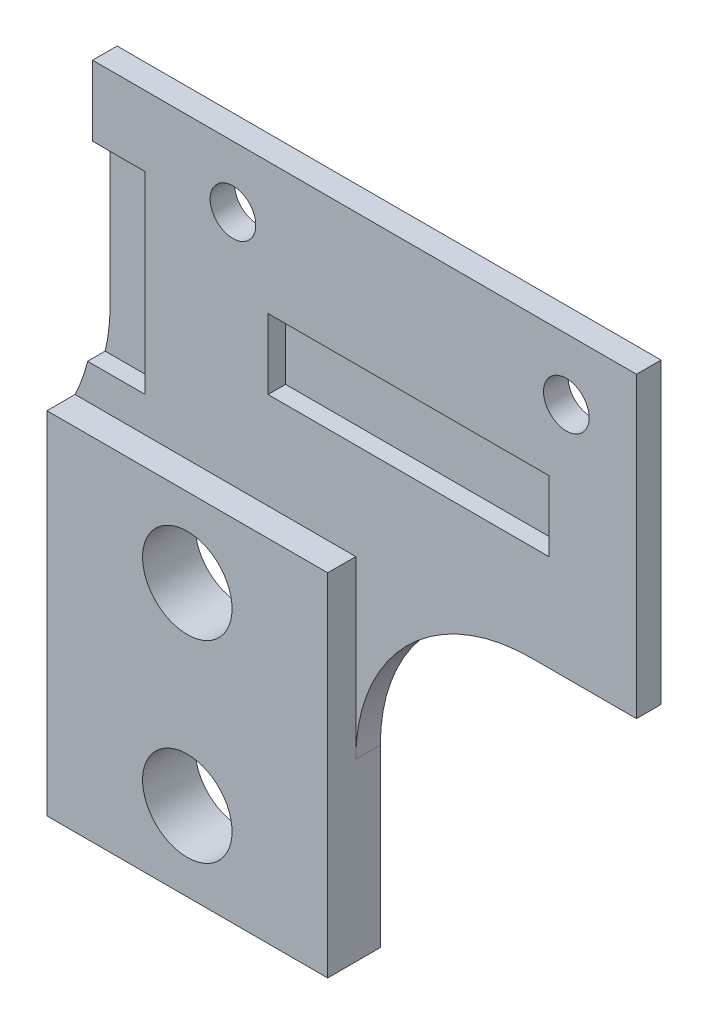
ISO-10303-21;
HEADER;
FILE_DESCRIPTION(('STEP AP214'),'2;1');
FILE_NAME('part.step','',(''),(''),'','','');
FILE_SCHEMA(('AUTOMOTIVE_DESIGN { 1 0 10303 214 1 1 1 1 }'));
ENDSEC;
DATA;
#1=APPLICATION_CONTEXT('core data for automotive mechanical design processes');
#2=APPLICATION_PROTOCOL_DEFINITION('international standard','automotive_design',2000,#1);
#3=PRODUCT_CONTEXT('',#1,'mechanical');
#4=PRODUCT('Part','Part','',(#3));
#5=PRODUCT_RELATED_PRODUCT_CATEGORY('part','',(#4));
#6=PRODUCT_DEFINITION_FORMATION('','',#4);
#7=PRODUCT_DEFINITION_CONTEXT('part definition',#1,'design');
#8=PRODUCT_DEFINITION('design','',#6,#7);
#9=PRODUCT_DEFINITION_SHAPE('','',#8);
#10=(LENGTH_UNIT() NAMED_UNIT(*) SI_UNIT(.MILLI.,.METRE.));
#11=(NAMED_UNIT(*) PLANE_ANGLE_UNIT() SI_UNIT($,.RADIAN.));
#12=(NAMED_UNIT(*) SI_UNIT($,.STERADIAN.) SOLID_ANGLE_UNIT());
#13=UNCERTAINTY_MEASURE_WITH_UNIT(LENGTH_MEASURE(1.E-05),#10,'distance_accuracy_value','');
#14=(GEOMETRIC_REPRESENTATION_CONTEXT(3) GLOBAL_UNCERTAINTY_ASSIGNED_CONTEXT((#13)) GLOBAL_UNIT_ASSIGNED_CONTEXT((#10,
#11,#12)) REPRESENTATION_CONTEXT('',''));
#15=CARTESIAN_POINT('',(0.,0.,0.));
#16=DIRECTION('',(0.,0.,1.));
#17=DIRECTION('',(1.,0.,0.));
#18=AXIS2_PLACEMENT_3D('',#15,#16,#17);
#19=CARTESIAN_POINT('',(-20.,8.5,1.4));
#20=DIRECTION('',(0.,-1.,0.));
#21=DIRECTION('',(0.,0.,-1.));
#22=AXIS2_PLACEMENT_3D('',#19,#20,#21);
#23=PLANE('',#22);
#24=DIRECTION('',(0.,0.,-1.));
#25=VECTOR('',#24,1.);
#26=CARTESIAN_POINT('',(-11.,8.5,21.));
#27=LINE('',#26,#25);
#28=CARTESIAN_POINT('',(-11.,8.5,1.4));
#29=VERTEX_POINT('',#28);
#30=CARTESIAN_POINT('',(-11.,8.5,0.));
#31=VERTEX_POINT('',#30);
#32=EDGE_CURVE('E209',#29,#31,#27,.T.);
#33=ORIENTED_EDGE('',*,*,#32,.F.);
#34=DIRECTION('',(-1.,0.,0.));
#35=VECTOR('',#34,1.);
#36=CARTESIAN_POINT('',(-20.,8.5,1.4));
#37=LINE('',#36,#35);
#38=CARTESIAN_POINT('',(20.,8.5,1.4));
#39=VERTEX_POINT('',#38);
#40=EDGE_CURVE('E285',#39,#29,#37,.T.);
#41=ORIENTED_EDGE('',*,*,#40,.F.);
#42=DIRECTION('',(0.,0.,-1.));
#43=VECTOR('',#42,1.);
#44=CARTESIAN_POINT('',(20.,8.5,1.4));
#45=LINE('',#44,#43);
#46=CARTESIAN_POINT('',(20.,8.5,0.));
#47=VERTEX_POINT('',#46);
#48=EDGE_CURVE('E300',#39,#47,#45,.T.);
#49=ORIENTED_EDGE('',*,*,#48,.T.);
#50=DIRECTION('',(-1.,0.,0.));
#51=VECTOR('',#50,1.);
#52=CARTESIAN_POINT('',(-20.,8.5,0.));
#53=LINE('',#52,#51);
#54=EDGE_CURVE('E294',#47,#31,#53,.T.);
#55=ORIENTED_EDGE('',*,*,#54,.T.);
#56=EDGE_LOOP('',(#33,#41,#49,#55));
#57=FACE_BOUND('',#56,.T.);
#58=ADVANCED_FACE('F32',(#57),#23,.F.);
#59=CARTESIAN_POINT('',(-20.,-8.5,1.4));
#60=DIRECTION('',(0.,1.,0.));
#61=DIRECTION('',(0.,0.,1.));
#62=AXIS2_PLACEMENT_3D('',#59,#60,#61);
#63=PLANE('',#62);
#64=DIRECTION('',(1.,0.,0.));
#65=VECTOR('',#64,1.);
#66=CARTESIAN_POINT('',(-20.,-8.5,1.4));
#67=LINE('',#66,#65);
#68=CARTESIAN_POINT('',(14.,-8.5,1.4));
#69=VERTEX_POINT('',#68);
#70=CARTESIAN_POINT('',(20.,-8.5,1.4));
#71=VERTEX_POINT('',#70);
#72=EDGE_CURVE('E289',#69,#71,#67,.T.);
#73=ORIENTED_EDGE('',*,*,#72,.F.);
#74=DIRECTION('',(0.,0.,-1.));
#75=VECTOR('',#74,1.);
#76=CARTESIAN_POINT('',(14.,-8.5,0.));
#77=LINE('',#76,#75);
#78=CARTESIAN_POINT('',(14.,-8.5,0.));
#79=VERTEX_POINT('',#78);
#80=EDGE_CURVE('E305',#69,#79,#77,.T.);
#81=ORIENTED_EDGE('',*,*,#80,.T.);
#82=DIRECTION('',(1.,0.,0.));
#83=VECTOR('',#82,1.);
#84=CARTESIAN_POINT('',(-20.,-8.5,0.));
#85=LINE('',#84,#83);
#86=CARTESIAN_POINT('',(20.,-8.5,0.));
#87=VERTEX_POINT('',#86);
#88=EDGE_CURVE('E286',#79,#87,#85,.T.);
#89=ORIENTED_EDGE('',*,*,#88,.T.);
#90=DIRECTION('',(0.,0.,-1.));
#91=VECTOR('',#90,1.);
#92=CARTESIAN_POINT('',(20.,-8.5,1.4));
#93=LINE('',#92,#91);
#94=EDGE_CURVE('E291',#71,#87,#93,.T.);
#95=ORIENTED_EDGE('',*,*,#94,.F.);
#96=EDGE_LOOP('',(#73,#81,#89,#95));
#97=FACE_BOUND('',#96,.T.);
#98=ADVANCED_FACE('F338',(#97),#63,.F.);
#99=CARTESIAN_POINT('',(0.,0.,1.4));
#100=DIRECTION('',(0.,0.,-1.));
#101=DIRECTION('',(-1.,0.,0.));
#102=AXIS2_PLACEMENT_3D('',#99,#100,#101);
#103=PLANE('',#102);
#104=DIRECTION('',(0.,-1.,0.));
#105=VECTOR('',#104,1.);
#106=CARTESIAN_POINT('',(-0.999999999999977,0.,1.4));
#107=LINE('',#106,#105);
#108=CARTESIAN_POINT('',(-0.999999999999977,0.999999999999996,1.4));
#109=VERTEX_POINT('',#108);
#110=CARTESIAN_POINT('',(-0.999999999999977,-3.,1.4));
#111=VERTEX_POINT('',#110);
#112=EDGE_CURVE('E243',#109,#111,#107,.T.);
#113=ORIENTED_EDGE('',*,*,#112,.F.);
#114=DIRECTION('',(-1.,0.,0.));
#115=VECTOR('',#114,1.);
#116=CARTESIAN_POINT('',(0.,0.999999999999996,1.4));
#117=LINE('',#116,#115);
#118=CARTESIAN_POINT('',(15.,0.999999999999996,1.4));
#119=VERTEX_POINT('',#118);
#120=EDGE_CURVE('E241',#119,#109,#117,.T.);
#121=ORIENTED_EDGE('',*,*,#120,.F.);
#122=DIRECTION('',(0.,1.,0.));
#123=VECTOR('',#122,1.);
#124=CARTESIAN_POINT('',(15.,0.,1.4));
#125=LINE('',#124,#123);
#126=CARTESIAN_POINT('',(15.,-3.,1.4));
#127=VERTEX_POINT('',#126);
#128=EDGE_CURVE('E231',#127,#119,#125,.T.);
#129=ORIENTED_EDGE('',*,*,#128,.F.);
#130=DIRECTION('',(1.,0.,0.));
#131=VECTOR('',#130,1.);
#132=CARTESIAN_POINT('',(0.,-3.,1.4));
#133=LINE('',#132,#131);
#134=EDGE_CURVE('E247',#111,#127,#133,.T.);
#135=ORIENTED_EDGE('',*,*,#134,.F.);
#136=EDGE_LOOP('',(#113,#121,#129,#135));
#137=FACE_BOUND('',#136,.T.);
#138=CARTESIAN_POINT('',(-2.99999999999997,5.,1.4));
#139=DIRECTION('',(0.,0.,-1.));
#140=DIRECTION('',(-1.,0.,0.));
#141=AXIS2_PLACEMENT_3D('',#138,#139,#140);
#142=CIRCLE('',#141,1.3);
#143=CARTESIAN_POINT('',(-4.29999999999997,5.,1.4));
#144=VERTEX_POINT('',#143);
#145=EDGE_CURVE('E218',#144,#144,#142,.F.);
#146=ORIENTED_EDGE('',*,*,#145,.F.);
#147=EDGE_LOOP('',(#146));
#148=FACE_BOUND('',#147,.T.);
#149=CARTESIAN_POINT('',(16.,5.,1.4));
#150=DIRECTION('',(0.,0.,-1.));
#151=DIRECTION('',(-1.,0.,0.));
#152=AXIS2_PLACEMENT_3D('',#149,#150,#151);
#153=CIRCLE('',#152,1.3);
#154=CARTESIAN_POINT('',(14.7,5.,1.4));
#155=VERTEX_POINT('',#154);
#156=EDGE_CURVE('E223',#155,#155,#153,.F.);
#157=ORIENTED_EDGE('',*,*,#156,.F.);
#158=EDGE_LOOP('',(#157));
#159=FACE_BOUND('',#158,.T.);
#160=DIRECTION('',(1.,0.,0.));
#161=VECTOR('',#160,1.);
#162=CARTESIAN_POINT('',(0.,-6.5,1.4));
#163=LINE('',#162,#161);
#164=CARTESIAN_POINT('',(-11.2822021129186,-6.5,1.4));
#165=VERTEX_POINT('',#164);
#166=CARTESIAN_POINT('',(-7.99999999999998,-6.5,1.4));
#167=VERTEX_POINT('',#166);
#168=EDGE_CURVE('E47',#165,#167,#163,.T.);
#169=ORIENTED_EDGE('',*,*,#168,.F.);
#170=CARTESIAN_POINT('',(-21.,-4.14110105645934,1.4));
#171=DIRECTION('',(0.,0.,-1.));
#172=DIRECTION('',(-1.,0.,0.));
#173=AXIS2_PLACEMENT_3D('',#170,#171,#172);
#174=CIRCLE('',#173,10.);
#175=CARTESIAN_POINT('',(-12.,-8.5,1.4));
#176=VERTEX_POINT('',#175);
#177=EDGE_CURVE('E319',#165,#176,#174,.T.);
#178=ORIENTED_EDGE('',*,*,#177,.T.);
#179=CARTESIAN_POINT('',(4.00000000000003,-8.5,1.4));
#180=VERTEX_POINT('',#179);
#181=EDGE_CURVE('E178',#176,#180,#67,.T.);
#182=ORIENTED_EDGE('',*,*,#181,.T.);
#183=DIRECTION('',(0.,1.,0.));
#184=VECTOR('',#183,1.);
#185=CARTESIAN_POINT('',(4.00000000000003,0.,1.4));
#186=LINE('',#185,#184);
#187=CARTESIAN_POINT('',(4.00000000000003,-18.5,1.4));
#188=VERTEX_POINT('',#187);
#189=EDGE_CURVE('E308',#188,#180,#186,.T.);
#190=ORIENTED_EDGE('',*,*,#189,.F.);
#191=CARTESIAN_POINT('',(14.,-18.5,1.4));
#192=DIRECTION('',(0.,0.,-1.));
#193=DIRECTION('',(-1.,0.,0.));
#194=AXIS2_PLACEMENT_3D('',#191,#192,#193);
#195=CIRCLE('',#194,10.);
#196=EDGE_CURVE('E11',#188,#69,#195,.T.);
#197=ORIENTED_EDGE('',*,*,#196,.T.);
#198=ORIENTED_EDGE('',*,*,#72,.T.);
#199=DIRECTION('',(0.,1.,0.));
#200=VECTOR('',#199,1.);
#201=CARTESIAN_POINT('',(20.,-8.5,1.4));
#202=LINE('',#201,#200);
#203=EDGE_CURVE('E282',#71,#39,#202,.T.);
#204=ORIENTED_EDGE('',*,*,#203,.T.);
#205=ORIENTED_EDGE('',*,*,#40,.T.);
#206=DIRECTION('',(0.,1.,0.));
#207=VECTOR('',#206,1.);
#208=CARTESIAN_POINT('',(-11.,0.,1.4));
#209=LINE('',#208,#207);
#210=CARTESIAN_POINT('',(-11.,4.5,1.4));
#211=VERTEX_POINT('',#210);
#212=EDGE_CURVE('E212',#211,#29,#209,.T.);
#213=ORIENTED_EDGE('',*,*,#212,.F.);
#214=DIRECTION('',(-1.,0.,0.));
#215=VECTOR('',#214,1.);
#216=CARTESIAN_POINT('',(0.,4.5,1.4));
#217=LINE('',#216,#215);
#218=CARTESIAN_POINT('',(-7.99999999999998,4.5,1.4));
#219=VERTEX_POINT('',#218);
#220=EDGE_CURVE('E273',#219,#211,#217,.T.);
#221=ORIENTED_EDGE('',*,*,#220,.F.);
#222=DIRECTION('',(0.,1.,0.));
#223=VECTOR('',#222,1.);
#224=CARTESIAN_POINT('',(-7.99999999999998,0.,1.4));
#225=LINE('',#224,#223);
#226=EDGE_CURVE('E226',#167,#219,#225,.T.);
#227=ORIENTED_EDGE('',*,*,#226,.F.);
#228=EDGE_LOOP('',(#169,#178,#182,#190,#197,#198,#204,#205,#213,#221,#227));
#229=FACE_BOUND('',#228,.T.);
#230=ADVANCED_FACE('F335',(#137,#148,#159,#229),#103,.F.);
#231=CARTESIAN_POINT('',(0.,0.,0.));
#232=DIRECTION('',(0.,0.,-1.));
#233=DIRECTION('',(-1.,0.,0.));
#234=AXIS2_PLACEMENT_3D('',#231,#232,#233);
#235=PLANE('',#234);
#236=CARTESIAN_POINT('',(16.,5.,0.));
#237=DIRECTION('',(0.,0.,1.));
#238=DIRECTION('',(1.,0.,0.));
#239=AXIS2_PLACEMENT_3D('',#236,#237,#238);
#240=CIRCLE('',#239,1.3);
#241=CARTESIAN_POINT('',(17.3,5.,0.));
#242=VERTEX_POINT('',#241);
#243=EDGE_CURVE('E215',#242,#242,#240,.T.);
#244=ORIENTED_EDGE('',*,*,#243,.T.);
#245=EDGE_LOOP('',(#244));
#246=FACE_BOUND('',#245,.T.);
#247=CARTESIAN_POINT('',(-2.99999999999997,5.,0.));
#248=DIRECTION('',(0.,0.,1.));
#249=DIRECTION('',(1.,0.,0.));
#250=AXIS2_PLACEMENT_3D('',#247,#248,#249);
#251=CIRCLE('',#250,1.3);
#252=CARTESIAN_POINT('',(-1.69999999999997,5.,0.));
#253=VERTEX_POINT('',#252);
#254=EDGE_CURVE('E214',#253,#253,#251,.T.);
#255=ORIENTED_EDGE('',*,*,#254,.T.);
#256=EDGE_LOOP('',(#255));
#257=FACE_BOUND('',#256,.T.);
#258=ORIENTED_EDGE('',*,*,#88,.F.);
#259=CARTESIAN_POINT('',(14.,-18.5,0.));
#260=DIRECTION('',(0.,0.,-1.));
#261=DIRECTION('',(-1.,0.,0.));
#262=AXIS2_PLACEMENT_3D('',#259,#260,#261);
#263=CIRCLE('',#262,10.);
#264=CARTESIAN_POINT('',(4.00000000000003,-18.5,0.));
#265=VERTEX_POINT('',#264);
#266=EDGE_CURVE('E40',#79,#265,#263,.F.);
#267=ORIENTED_EDGE('',*,*,#266,.T.);
#268=DIRECTION('',(0.,1.,0.));
#269=VECTOR('',#268,1.);
#270=CARTESIAN_POINT('',(4.00000000000003,-8.5,0.));
#271=LINE('',#270,#269);
#272=CARTESIAN_POINT('',(4.00000000000003,-28.5,0.));
#273=VERTEX_POINT('',#272);
#274=EDGE_CURVE('E172',#273,#265,#271,.T.);
#275=ORIENTED_EDGE('',*,*,#274,.F.);
#276=DIRECTION('',(1.,0.,0.));
#277=VECTOR('',#276,1.);
#278=CARTESIAN_POINT('',(4.00000000000003,-28.5,0.));
#279=LINE('',#278,#277);
#280=CARTESIAN_POINT('',(-12.,-28.5,0.));
#281=VERTEX_POINT('',#280);
#282=EDGE_CURVE('E198',#281,#273,#279,.T.);
#283=ORIENTED_EDGE('',*,*,#282,.F.);
#284=DIRECTION('',(0.,-1.,0.));
#285=VECTOR('',#284,1.);
#286=CARTESIAN_POINT('',(-12.,-8.5,0.));
#287=LINE('',#286,#285);
#288=CARTESIAN_POINT('',(-12.,-8.5,0.));
#289=VERTEX_POINT('',#288);
#290=EDGE_CURVE('E196',#289,#281,#287,.T.);
#291=ORIENTED_EDGE('',*,*,#290,.F.);
#292=CARTESIAN_POINT('',(-21.,-4.14110105645934,0.));
#293=DIRECTION('',(0.,0.,-1.));
#294=DIRECTION('',(-1.,0.,0.));
#295=AXIS2_PLACEMENT_3D('',#292,#293,#294);
#296=CIRCLE('',#295,10.);
#297=CARTESIAN_POINT('',(-11.,-4.14110105645934,0.));
#298=VERTEX_POINT('',#297);
#299=EDGE_CURVE('E313',#289,#298,#296,.F.);
#300=ORIENTED_EDGE('',*,*,#299,.T.);
#301=DIRECTION('',(0.,1.,0.));
#302=VECTOR('',#301,1.);
#303=CARTESIAN_POINT('',(-11.,8.5,0.));
#304=LINE('',#303,#302);
#305=EDGE_CURVE('E182',#298,#31,#304,.T.);
#306=ORIENTED_EDGE('',*,*,#305,.T.);
#307=ORIENTED_EDGE('',*,*,#54,.F.);
#308=DIRECTION('',(0.,1.,0.));
#309=VECTOR('',#308,1.);
#310=CARTESIAN_POINT('',(20.,-8.5,0.));
#311=LINE('',#310,#309);
#312=EDGE_CURVE('E254',#87,#47,#311,.T.);
#313=ORIENTED_EDGE('',*,*,#312,.F.);
#314=EDGE_LOOP('',(#258,#267,#275,#283,#291,#300,#306,#307,#313));
#315=FACE_BOUND('',#314,.T.);
#316=CARTESIAN_POINT('',(-3.99999999999997,-13.,0.));
#317=DIRECTION('',(0.,0.,1.));
#318=DIRECTION('',(1.,0.,0.));
#319=AXIS2_PLACEMENT_3D('',#316,#317,#318);
#320=CIRCLE('',#319,2.55);
#321=CARTESIAN_POINT('',(-1.44999999999997,-13.,0.));
#322=VERTEX_POINT('',#321);
#323=EDGE_CURVE('E627',#322,#322,#320,.T.);
#324=ORIENTED_EDGE('',*,*,#323,.T.);
#325=EDGE_LOOP('',(#324));
#326=FACE_BOUND('',#325,.T.);
#327=CARTESIAN_POINT('',(-3.99999999999997,-24.,0.));
#328=DIRECTION('',(0.,0.,1.));
#329=DIRECTION('',(1.,0.,0.));
#330=AXIS2_PLACEMENT_3D('',#327,#328,#329);
#331=CIRCLE('',#330,2.55);
#332=CARTESIAN_POINT('',(-1.44999999999997,-24.,0.));
#333=VERTEX_POINT('',#332);
#334=EDGE_CURVE('E624',#333,#333,#331,.T.);
#335=ORIENTED_EDGE('',*,*,#334,.T.);
#336=EDGE_LOOP('',(#335));
#337=FACE_BOUND('',#336,.T.);
#338=ADVANCED_FACE('F323',(#246,#257,#315,#326,#337),#235,.T.);
#339=CARTESIAN_POINT('',(20.,-8.5,1.4));
#340=DIRECTION('',(-1.,0.,0.));
#341=DIRECTION('',(0.,0.,1.));
#342=AXIS2_PLACEMENT_3D('',#339,#340,#341);
#343=PLANE('',#342);
#344=ORIENTED_EDGE('',*,*,#312,.T.);
#345=ORIENTED_EDGE('',*,*,#48,.F.);
#346=ORIENTED_EDGE('',*,*,#203,.F.);
#347=ORIENTED_EDGE('',*,*,#94,.T.);
#348=EDGE_LOOP('',(#344,#345,#346,#347));
#349=FACE_BOUND('',#348,.T.);
#350=ADVANCED_FACE('F342',(#349),#343,.F.);
#351=CARTESIAN_POINT('',(-7.99999999999998,0.,0.4));
#352=DIRECTION('',(1.,0.,0.));
#353=DIRECTION('',(0.,0.,-1.));
#354=AXIS2_PLACEMENT_3D('',#351,#352,#353);
#355=PLANE('',#354);
#356=ORIENTED_EDGE('',*,*,#226,.T.);
#357=DIRECTION('',(0.,0.,1.));
#358=VECTOR('',#357,1.);
#359=CARTESIAN_POINT('',(-7.99999999999998,4.5,0.4));
#360=LINE('',#359,#358);
#361=CARTESIAN_POINT('',(-7.99999999999998,4.5,0.4));
#362=VERTEX_POINT('',#361);
#363=EDGE_CURVE('E271',#362,#219,#360,.T.);
#364=ORIENTED_EDGE('',*,*,#363,.F.);
#365=DIRECTION('',(0.,1.,0.));
#366=VECTOR('',#365,1.);
#367=CARTESIAN_POINT('',(-7.99999999999998,0.,0.4));
#368=LINE('',#367,#366);
#369=CARTESIAN_POINT('',(-7.99999999999998,-6.5,0.4));
#370=VERTEX_POINT('',#369);
#371=EDGE_CURVE('E261',#370,#362,#368,.T.);
#372=ORIENTED_EDGE('',*,*,#371,.F.);
#373=DIRECTION('',(0.,0.,1.));
#374=VECTOR('',#373,1.);
#375=CARTESIAN_POINT('',(-7.99999999999998,-6.5,0.4));
#376=LINE('',#375,#374);
#377=EDGE_CURVE('E244',#370,#167,#376,.T.);
#378=ORIENTED_EDGE('',*,*,#377,.T.);
#379=EDGE_LOOP('',(#356,#364,#372,#378));
#380=FACE_BOUND('',#379,.T.);
#381=ADVANCED_FACE('F360',(#380),#355,.F.);
#382=CARTESIAN_POINT('',(0.,-6.5,0.4));
#383=DIRECTION('',(0.,-1.,0.));
#384=DIRECTION('',(0.,0.,-1.));
#385=AXIS2_PLACEMENT_3D('',#382,#383,#384);
#386=PLANE('',#385);
#387=ORIENTED_EDGE('',*,*,#168,.T.);
#388=ORIENTED_EDGE('',*,*,#377,.F.);
#389=DIRECTION('',(1.,0.,0.));
#390=VECTOR('',#389,1.);
#391=CARTESIAN_POINT('',(0.,-6.5,0.4));
#392=LINE('',#391,#390);
#393=CARTESIAN_POINT('',(-11.2822021129186,-6.5,0.4));
#394=VERTEX_POINT('',#393);
#395=EDGE_CURVE('E54',#394,#370,#392,.T.);
#396=ORIENTED_EDGE('',*,*,#395,.F.);
#397=DIRECTION('',(0.,0.,1.));
#398=VECTOR('',#397,1.);
#399=CARTESIAN_POINT('',(-11.2822021129186,-6.5,0.4));
#400=LINE('',#399,#398);
#401=EDGE_CURVE('E317',#394,#165,#400,.T.);
#402=ORIENTED_EDGE('',*,*,#401,.T.);
#403=EDGE_LOOP('',(#387,#388,#396,#402));
#404=FACE_BOUND('',#403,.T.);
#405=ADVANCED_FACE('F361',(#404),#386,.F.);
#406=CARTESIAN_POINT('',(0.,4.5,0.4));
#407=DIRECTION('',(0.,1.,0.));
#408=DIRECTION('',(0.,0.,1.));
#409=AXIS2_PLACEMENT_3D('',#406,#407,#408);
#410=PLANE('',#409);
#411=ORIENTED_EDGE('',*,*,#220,.T.);
#412=DIRECTION('',(0.,0.,1.));
#413=VECTOR('',#412,1.);
#414=CARTESIAN_POINT('',(-11.,4.5,0.4));
#415=LINE('',#414,#413);
#416=CARTESIAN_POINT('',(-11.,4.5,0.4));
#417=VERTEX_POINT('',#416);
#418=EDGE_CURVE('E278',#417,#211,#415,.T.);
#419=ORIENTED_EDGE('',*,*,#418,.F.);
#420=DIRECTION('',(-1.,0.,0.));
#421=VECTOR('',#420,1.);
#422=CARTESIAN_POINT('',(0.,4.5,0.4));
#423=LINE('',#422,#421);
#424=EDGE_CURVE('E264',#362,#417,#423,.T.);
#425=ORIENTED_EDGE('',*,*,#424,.F.);
#426=ORIENTED_EDGE('',*,*,#363,.T.);
#427=EDGE_LOOP('',(#411,#419,#425,#426));
#428=FACE_BOUND('',#427,.T.);
#429=ADVANCED_FACE('F354',(#428),#410,.F.);
#430=CARTESIAN_POINT('',(0.,0.,0.4));
#431=DIRECTION('',(0.,0.,1.));
#432=DIRECTION('',(1.,0.,0.));
#433=AXIS2_PLACEMENT_3D('',#430,#431,#432);
#434=PLANE('',#433);
#435=ORIENTED_EDGE('',*,*,#371,.T.);
#436=ORIENTED_EDGE('',*,*,#424,.T.);
#437=DIRECTION('',(0.,-1.,0.));
#438=VECTOR('',#437,1.);
#439=CARTESIAN_POINT('',(-11.,0.,0.4));
#440=LINE('',#439,#438);
#441=CARTESIAN_POINT('',(-11.,-4.14110105645934,0.4));
#442=VERTEX_POINT('',#441);
#443=EDGE_CURVE('E267',#417,#442,#440,.T.);
#444=ORIENTED_EDGE('',*,*,#443,.T.);
#445=CARTESIAN_POINT('',(-21.,-4.14110105645934,0.4));
#446=DIRECTION('',(0.,0.,1.));
#447=DIRECTION('',(1.,0.,0.));
#448=AXIS2_PLACEMENT_3D('',#445,#446,#447);
#449=CIRCLE('',#448,10.);
#450=EDGE_CURVE('E315',#442,#394,#449,.F.);
#451=ORIENTED_EDGE('',*,*,#450,.T.);
#452=ORIENTED_EDGE('',*,*,#395,.T.);
#453=EDGE_LOOP('',(#435,#436,#444,#451,#452));
#454=FACE_BOUND('',#453,.T.);
#455=ADVANCED_FACE('F356',(#454),#434,.T.);
#456=CARTESIAN_POINT('',(0.,0.999999999999996,0.4));
#457=DIRECTION('',(0.,1.,0.));
#458=DIRECTION('',(0.,0.,1.));
#459=AXIS2_PLACEMENT_3D('',#456,#457,#458);
#460=PLANE('',#459);
#461=ORIENTED_EDGE('',*,*,#120,.T.);
#462=DIRECTION('',(0.,0.,1.));
#463=VECTOR('',#462,1.);
#464=CARTESIAN_POINT('',(-0.999999999999977,0.999999999999996,0.4));
#465=LINE('',#464,#463);
#466=CARTESIAN_POINT('',(-0.999999999999977,0.999999999999996,0.4));
#467=VERTEX_POINT('',#466);
#468=EDGE_CURVE('E240',#467,#109,#465,.T.);
#469=ORIENTED_EDGE('',*,*,#468,.F.);
#470=DIRECTION('',(-1.,0.,0.));
#471=VECTOR('',#470,1.);
#472=CARTESIAN_POINT('',(0.,0.999999999999996,0.4));
#473=LINE('',#472,#471);
#474=CARTESIAN_POINT('',(15.,0.999999999999996,0.4));
#475=VERTEX_POINT('',#474);
#476=EDGE_CURVE('E227',#475,#467,#473,.T.);
#477=ORIENTED_EDGE('',*,*,#476,.F.);
#478=DIRECTION('',(0.,0.,1.));
#479=VECTOR('',#478,1.);
#480=CARTESIAN_POINT('',(15.,0.999999999999996,0.4));
#481=LINE('',#480,#479);
#482=EDGE_CURVE('E252',#475,#119,#481,.T.);
#483=ORIENTED_EDGE('',*,*,#482,.T.);
#484=EDGE_LOOP('',(#461,#469,#477,#483));
#485=FACE_BOUND('',#484,.T.);
#486=ADVANCED_FACE('F430',(#485),#460,.F.);
#487=CARTESIAN_POINT('',(15.,0.,0.4));
#488=DIRECTION('',(1.,0.,0.));
#489=DIRECTION('',(0.,0.,-1.));
#490=AXIS2_PLACEMENT_3D('',#487,#488,#489);
#491=PLANE('',#490);
#492=ORIENTED_EDGE('',*,*,#128,.T.);
#493=ORIENTED_EDGE('',*,*,#482,.F.);
#494=DIRECTION('',(0.,1.,0.));
#495=VECTOR('',#494,1.);
#496=CARTESIAN_POINT('',(15.,0.,0.4));
#497=LINE('',#496,#495);
#498=CARTESIAN_POINT('',(15.,-3.,0.4));
#499=VERTEX_POINT('',#498);
#500=EDGE_CURVE('E237',#499,#475,#497,.T.);
#501=ORIENTED_EDGE('',*,*,#500,.F.);
#502=DIRECTION('',(0.,0.,1.));
#503=VECTOR('',#502,1.);
#504=CARTESIAN_POINT('',(15.,-3.,0.4));
#505=LINE('',#504,#503);
#506=EDGE_CURVE('E255',#499,#127,#505,.T.);
#507=ORIENTED_EDGE('',*,*,#506,.T.);
#508=EDGE_LOOP('',(#492,#493,#501,#507));
#509=FACE_BOUND('',#508,.T.);
#510=ADVANCED_FACE('F426',(#509),#491,.F.);
#511=CARTESIAN_POINT('',(0.,-3.,0.4));
#512=DIRECTION('',(0.,-1.,0.));
#513=DIRECTION('',(0.,0.,-1.));
#514=AXIS2_PLACEMENT_3D('',#511,#512,#513);
#515=PLANE('',#514);
#516=ORIENTED_EDGE('',*,*,#134,.T.);
#517=ORIENTED_EDGE('',*,*,#506,.F.);
#518=DIRECTION('',(1.,0.,0.));
#519=VECTOR('',#518,1.);
#520=CARTESIAN_POINT('',(0.,-3.,0.4));
#521=LINE('',#520,#519);
#522=CARTESIAN_POINT('',(-0.999999999999977,-3.,0.4));
#523=VERTEX_POINT('',#522);
#524=EDGE_CURVE('E234',#523,#499,#521,.T.);
#525=ORIENTED_EDGE('',*,*,#524,.F.);
#526=DIRECTION('',(0.,0.,1.));
#527=VECTOR('',#526,1.);
#528=CARTESIAN_POINT('',(-0.999999999999977,-3.,0.4));
#529=LINE('',#528,#527);
#530=EDGE_CURVE('E257',#523,#111,#529,.T.);
#531=ORIENTED_EDGE('',*,*,#530,.T.);
#532=EDGE_LOOP('',(#516,#517,#525,#531));
#533=FACE_BOUND('',#532,.T.);
#534=ADVANCED_FACE('F429',(#533),#515,.F.);
#535=CARTESIAN_POINT('',(-0.999999999999977,0.,0.4));
#536=DIRECTION('',(-1.,0.,0.));
#537=DIRECTION('',(0.,-1.,0.));
#538=AXIS2_PLACEMENT_3D('',#535,#536,#537);
#539=PLANE('',#538);
#540=ORIENTED_EDGE('',*,*,#112,.T.);
#541=ORIENTED_EDGE('',*,*,#530,.F.);
#542=DIRECTION('',(0.,-1.,0.));
#543=VECTOR('',#542,1.);
#544=CARTESIAN_POINT('',(-0.999999999999977,0.,0.4));
#545=LINE('',#544,#543);
#546=EDGE_CURVE('E230',#467,#523,#545,.T.);
#547=ORIENTED_EDGE('',*,*,#546,.F.);
#548=ORIENTED_EDGE('',*,*,#468,.T.);
#549=EDGE_LOOP('',(#540,#541,#547,#548));
#550=FACE_BOUND('',#549,.T.);
#551=ADVANCED_FACE('F424',(#550),#539,.F.);
#552=CARTESIAN_POINT('',(0.,0.,0.4));
#553=DIRECTION('',(0.,0.,1.));
#554=DIRECTION('',(1.,0.,0.));
#555=AXIS2_PLACEMENT_3D('',#552,#553,#554);
#556=PLANE('',#555);
#557=ORIENTED_EDGE('',*,*,#476,.T.);
#558=ORIENTED_EDGE('',*,*,#546,.T.);
#559=ORIENTED_EDGE('',*,*,#524,.T.);
#560=ORIENTED_EDGE('',*,*,#500,.T.);
#561=EDGE_LOOP('',(#557,#558,#559,#560));
#562=FACE_BOUND('',#561,.T.);
#563=ADVANCED_FACE('F420',(#562),#556,.T.);
#564=CARTESIAN_POINT('',(-2.99999999999997,5.,11.));
#565=DIRECTION('',(0.,0.,-1.));
#566=DIRECTION('',(-1.,0.,0.));
#567=AXIS2_PLACEMENT_3D('',#564,#565,#566);
#568=CYLINDRICAL_SURFACE('',#567,1.3);
#569=ORIENTED_EDGE('',*,*,#254,.F.);
#570=EDGE_LOOP('',(#569));
#571=FACE_BOUND('',#570,.T.);
#572=ORIENTED_EDGE('',*,*,#145,.T.);
#573=EDGE_LOOP('',(#572));
#574=FACE_BOUND('',#573,.T.);
#575=ADVANCED_FACE('F416',(#571,#574),#568,.F.);
#576=CARTESIAN_POINT('',(16.,5.,11.));
#577=DIRECTION('',(0.,0.,-1.));
#578=DIRECTION('',(-1.,0.,0.));
#579=AXIS2_PLACEMENT_3D('',#576,#577,#578);
#580=CYLINDRICAL_SURFACE('',#579,1.3);
#581=ORIENTED_EDGE('',*,*,#243,.F.);
#582=EDGE_LOOP('',(#581));
#583=FACE_BOUND('',#582,.T.);
#584=ORIENTED_EDGE('',*,*,#156,.T.);
#585=EDGE_LOOP('',(#584));
#586=FACE_BOUND('',#585,.T.);
#587=ADVANCED_FACE('F411',(#583,#586),#580,.F.);
#588=CARTESIAN_POINT('',(-11.,8.5,21.));
#589=DIRECTION('',(-1.,0.,0.));
#590=DIRECTION('',(0.,0.,1.));
#591=AXIS2_PLACEMENT_3D('',#588,#589,#590);
#592=PLANE('',#591);
#593=ORIENTED_EDGE('',*,*,#305,.F.);
#594=DIRECTION('',(0.,0.,-1.));
#595=VECTOR('',#594,1.);
#596=CARTESIAN_POINT('',(-11.,-4.14110105645934,1.4));
#597=LINE('',#596,#595);
#598=EDGE_CURVE('E303',#298,#442,#597,.F.);
#599=ORIENTED_EDGE('',*,*,#598,.T.);
#600=ORIENTED_EDGE('',*,*,#443,.F.);
#601=ORIENTED_EDGE('',*,*,#418,.T.);
#602=ORIENTED_EDGE('',*,*,#212,.T.);
#603=ORIENTED_EDGE('',*,*,#32,.T.);
#604=EDGE_LOOP('',(#593,#599,#600,#601,#602,#603));
#605=FACE_BOUND('',#604,.T.);
#606=ADVANCED_FACE('F349',(#605),#592,.T.);
#607=CARTESIAN_POINT('',(-3.99999999999997,-8.5,3.));
#608=DIRECTION('',(0.,-1.,0.));
#609=DIRECTION('',(1.,0.,0.));
#610=AXIS2_PLACEMENT_3D('',#607,#608,#609);
#611=PLANE('',#610);
#612=ORIENTED_EDGE('',*,*,#181,.F.);
#613=DIRECTION('',(0.,0.,-1.));
#614=VECTOR('',#613,1.);
#615=CARTESIAN_POINT('',(-12.,-8.5,3.));
#616=LINE('',#615,#614);
#617=CARTESIAN_POINT('',(-12.,-8.5,3.));
#618=VERTEX_POINT('',#617);
#619=EDGE_CURVE('E175',#618,#176,#616,.T.);
#620=ORIENTED_EDGE('',*,*,#619,.F.);
#621=DIRECTION('',(-1.,0.,0.));
#622=VECTOR('',#621,1.);
#623=CARTESIAN_POINT('',(-3.99999999999997,-8.5,3.));
#624=LINE('',#623,#622);
#625=CARTESIAN_POINT('',(4.00000000000003,-8.5,3.));
#626=VERTEX_POINT('',#625);
#627=EDGE_CURVE('E160',#626,#618,#624,.T.);
#628=ORIENTED_EDGE('',*,*,#627,.F.);
#629=DIRECTION('',(0.,0.,-1.));
#630=VECTOR('',#629,1.);
#631=CARTESIAN_POINT('',(4.00000000000003,-8.5,3.));
#632=LINE('',#631,#630);
#633=EDGE_CURVE('E195',#626,#180,#632,.T.);
#634=ORIENTED_EDGE('',*,*,#633,.T.);
#635=EDGE_LOOP('',(#612,#620,#628,#634));
#636=FACE_BOUND('',#635,.T.);
#637=ADVANCED_FACE('F176',(#636),#611,.F.);
#638=CARTESIAN_POINT('',(0.,0.,3.));
#639=DIRECTION('',(0.,0.,-1.));
#640=DIRECTION('',(-1.,0.,0.));
#641=AXIS2_PLACEMENT_3D('',#638,#639,#640);
#642=PLANE('',#641);
#643=ORIENTED_EDGE('',*,*,#627,.T.);
#644=DIRECTION('',(0.,-1.,0.));
#645=VECTOR('',#644,1.);
#646=CARTESIAN_POINT('',(-12.,-8.5,3.));
#647=LINE('',#646,#645);
#648=CARTESIAN_POINT('',(-12.,-28.5,3.));
#649=VERTEX_POINT('',#648);
#650=EDGE_CURVE('E165',#618,#649,#647,.T.);
#651=ORIENTED_EDGE('',*,*,#650,.T.);
#652=DIRECTION('',(1.,0.,0.));
#653=VECTOR('',#652,1.);
#654=CARTESIAN_POINT('',(4.00000000000003,-28.5,3.));
#655=LINE('',#654,#653);
#656=CARTESIAN_POINT('',(4.00000000000003,-28.5,3.));
#657=VERTEX_POINT('',#656);
#658=EDGE_CURVE('E189',#649,#657,#655,.T.);
#659=ORIENTED_EDGE('',*,*,#658,.T.);
#660=DIRECTION('',(0.,1.,0.));
#661=VECTOR('',#660,1.);
#662=CARTESIAN_POINT('',(4.00000000000003,-8.5,3.));
#663=LINE('',#662,#661);
#664=EDGE_CURVE('E168',#657,#626,#663,.T.);
#665=ORIENTED_EDGE('',*,*,#664,.T.);
#666=EDGE_LOOP('',(#643,#651,#659,#665));
#667=FACE_BOUND('',#666,.T.);
#668=CARTESIAN_POINT('',(-3.99999999999997,-13.,3.));
#669=DIRECTION('',(0.,0.,1.));
#670=DIRECTION('',(1.,0.,0.));
#671=AXIS2_PLACEMENT_3D('',#668,#669,#670);
#672=CIRCLE('',#671,2.55);
#673=CARTESIAN_POINT('',(-1.44999999999997,-13.,3.));
#674=VERTEX_POINT('',#673);
#675=EDGE_CURVE('E199',#674,#674,#672,.T.);
#676=ORIENTED_EDGE('',*,*,#675,.F.);
#677=EDGE_LOOP('',(#676));
#678=FACE_BOUND('',#677,.T.);
#679=CARTESIAN_POINT('',(-3.99999999999997,-24.,3.));
#680=DIRECTION('',(0.,0.,1.));
#681=DIRECTION('',(1.,0.,0.));
#682=AXIS2_PLACEMENT_3D('',#679,#680,#681);
#683=CIRCLE('',#682,2.55);
#684=CARTESIAN_POINT('',(-1.44999999999997,-24.,3.));
#685=VERTEX_POINT('',#684);
#686=EDGE_CURVE('E621',#685,#685,#683,.T.);
#687=ORIENTED_EDGE('',*,*,#686,.F.);
#688=EDGE_LOOP('',(#687));
#689=FACE_BOUND('',#688,.T.);
#690=ADVANCED_FACE('F162',(#667,#678,#689),#642,.F.);
#691=CARTESIAN_POINT('',(-12.,-8.5,3.));
#692=DIRECTION('',(1.,0.,0.));
#693=DIRECTION('',(0.,1.,0.));
#694=AXIS2_PLACEMENT_3D('',#691,#692,#693);
#695=PLANE('',#694);
#696=ORIENTED_EDGE('',*,*,#290,.T.);
#697=DIRECTION('',(0.,0.,-1.));
#698=VECTOR('',#697,1.);
#699=CARTESIAN_POINT('',(-12.,-28.5,3.));
#700=LINE('',#699,#698);
#701=EDGE_CURVE('E187',#649,#281,#700,.T.);
#702=ORIENTED_EDGE('',*,*,#701,.F.);
#703=ORIENTED_EDGE('',*,*,#650,.F.);
#704=ORIENTED_EDGE('',*,*,#619,.T.);
#705=EDGE_CURVE('E183',#176,#289,#616,.T.);
#706=ORIENTED_EDGE('',*,*,#705,.T.);
#707=EDGE_LOOP('',(#696,#702,#703,#704,#706));
#708=FACE_BOUND('',#707,.T.);
#709=ADVANCED_FACE('F185',(#708),#695,.F.);
#710=CARTESIAN_POINT('',(4.00000000000003,-28.5,3.));
#711=DIRECTION('',(0.,1.,0.));
#712=DIRECTION('',(-1.,0.,0.));
#713=AXIS2_PLACEMENT_3D('',#710,#711,#712);
#714=PLANE('',#713);
#715=ORIENTED_EDGE('',*,*,#282,.T.);
#716=DIRECTION('',(0.,0.,-1.));
#717=VECTOR('',#716,1.);
#718=CARTESIAN_POINT('',(4.00000000000003,-28.5,3.));
#719=LINE('',#718,#717);
#720=EDGE_CURVE('E204',#657,#273,#719,.T.);
#721=ORIENTED_EDGE('',*,*,#720,.F.);
#722=ORIENTED_EDGE('',*,*,#658,.F.);
#723=ORIENTED_EDGE('',*,*,#701,.T.);
#724=EDGE_LOOP('',(#715,#721,#722,#723));
#725=FACE_BOUND('',#724,.T.);
#726=ADVANCED_FACE('F368',(#725),#714,.F.);
#727=CARTESIAN_POINT('',(4.00000000000003,-8.5,3.));
#728=DIRECTION('',(-1.,0.,0.));
#729=DIRECTION('',(0.,-1.,0.));
#730=AXIS2_PLACEMENT_3D('',#727,#728,#729);
#731=PLANE('',#730);
#732=ORIENTED_EDGE('',*,*,#274,.T.);
#733=DIRECTION('',(0.,0.,-1.));
#734=VECTOR('',#733,1.);
#735=CARTESIAN_POINT('',(4.00000000000003,-18.5,1.4));
#736=LINE('',#735,#734);
#737=EDGE_CURVE('E310',#265,#188,#736,.F.);
#738=ORIENTED_EDGE('',*,*,#737,.T.);
#739=ORIENTED_EDGE('',*,*,#189,.T.);
#740=ORIENTED_EDGE('',*,*,#633,.F.);
#741=ORIENTED_EDGE('',*,*,#664,.F.);
#742=ORIENTED_EDGE('',*,*,#720,.T.);
#743=EDGE_LOOP('',(#732,#738,#739,#740,#741,#742));
#744=FACE_BOUND('',#743,.T.);
#745=ADVANCED_FACE('F331',(#744),#731,.F.);
#746=CARTESIAN_POINT('',(-3.99999999999997,-13.,3.));
#747=DIRECTION('',(0.,0.,-1.));
#748=DIRECTION('',(-1.,0.,0.));
#749=AXIS2_PLACEMENT_3D('',#746,#747,#748);
#750=CYLINDRICAL_SURFACE('',#749,2.55);
#751=ORIENTED_EDGE('',*,*,#675,.T.);
#752=EDGE_LOOP('',(#751));
#753=FACE_BOUND('',#752,.T.);
#754=ORIENTED_EDGE('',*,*,#323,.F.);
#755=EDGE_LOOP('',(#754));
#756=FACE_BOUND('',#755,.T.);
#757=ADVANCED_FACE('F375',(#753,#756),#750,.F.);
#758=CARTESIAN_POINT('',(-3.99999999999997,-24.,3.));
#759=DIRECTION('',(0.,0.,-1.));
#760=DIRECTION('',(-1.,0.,0.));
#761=AXIS2_PLACEMENT_3D('',#758,#759,#760);
#762=CYLINDRICAL_SURFACE('',#761,2.55);
#763=ORIENTED_EDGE('',*,*,#686,.T.);
#764=EDGE_LOOP('',(#763));
#765=FACE_BOUND('',#764,.T.);
#766=ORIENTED_EDGE('',*,*,#334,.F.);
#767=EDGE_LOOP('',(#766));
#768=FACE_BOUND('',#767,.T.);
#769=ADVANCED_FACE('F388',(#765,#768),#762,.F.);
#770=CARTESIAN_POINT('',(-21.,-4.14110105645934,3.));
#771=DIRECTION('',(0.,0.,1.));
#772=DIRECTION('',(1.,0.,0.));
#773=AXIS2_PLACEMENT_3D('',#770,#771,#772);
#774=CYLINDRICAL_SURFACE('',#773,10.);
#775=ORIENTED_EDGE('',*,*,#450,.F.);
#776=ORIENTED_EDGE('',*,*,#598,.F.);
#777=ORIENTED_EDGE('',*,*,#299,.F.);
#778=ORIENTED_EDGE('',*,*,#705,.F.);
#779=ORIENTED_EDGE('',*,*,#177,.F.);
#780=ORIENTED_EDGE('',*,*,#401,.F.);
#781=EDGE_LOOP('',(#775,#776,#777,#778,#779,#780));
#782=FACE_BOUND('',#781,.T.);
#783=ADVANCED_FACE('F365',(#782),#774,.F.);
#784=CARTESIAN_POINT('',(14.,-18.5,1.4));
#785=DIRECTION('',(0.,0.,1.));
#786=DIRECTION('',(1.,0.,0.));
#787=AXIS2_PLACEMENT_3D('',#784,#785,#786);
#788=CYLINDRICAL_SURFACE('',#787,10.);
#789=ORIENTED_EDGE('',*,*,#196,.F.);
#790=ORIENTED_EDGE('',*,*,#737,.F.);
#791=ORIENTED_EDGE('',*,*,#266,.F.);
#792=ORIENTED_EDGE('',*,*,#80,.F.);
#793=EDGE_LOOP('',(#789,#790,#791,#792));
#794=FACE_BOUND('',#793,.T.);
#795=ADVANCED_FACE('F34',(#794),#788,.F.);
#796=CLOSED_SHELL('',(#58,#98,#230,#338,#350,#381,#405,#429,#455,#486,#510,#534,#551,#563,#575,
#587,#606,#637,#690,#709,#726,#745,#757,#769,#783,#795));
#797=MANIFOLD_SOLID_BREP('B2',#796);
#798=ADVANCED_BREP_SHAPE_REPRESENTATION('',(#18,#797),#14);
#799=SHAPE_DEFINITION_REPRESENTATION(#9,#798);
ENDSEC;
END-ISO-10303-21;
